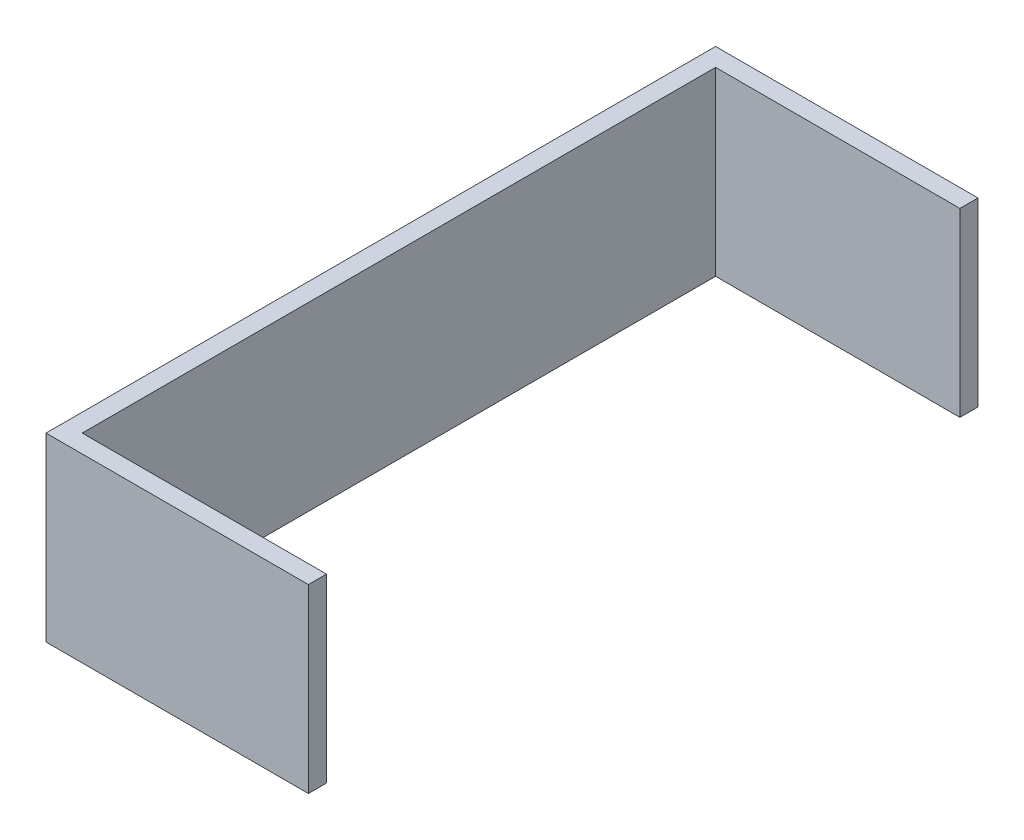
ISO-10303-21;
HEADER;
FILE_DESCRIPTION(('STEP AP214'),'2;1');
FILE_NAME('part.step','',(''),(''),'','','');
FILE_SCHEMA(('AUTOMOTIVE_DESIGN { 1 0 10303 214 1 1 1 1 }'));
ENDSEC;
DATA;
#1=APPLICATION_CONTEXT('core data for automotive mechanical design processes');
#2=APPLICATION_PROTOCOL_DEFINITION('international standard','automotive_design',2000,#1);
#3=PRODUCT_CONTEXT('',#1,'mechanical');
#4=PRODUCT('Part','Part','',(#3));
#5=PRODUCT_RELATED_PRODUCT_CATEGORY('part','',(#4));
#6=PRODUCT_DEFINITION_FORMATION('','',#4);
#7=PRODUCT_DEFINITION_CONTEXT('part definition',#1,'design');
#8=PRODUCT_DEFINITION('design','',#6,#7);
#9=PRODUCT_DEFINITION_SHAPE('','',#8);
#10=(LENGTH_UNIT() NAMED_UNIT(*) SI_UNIT(.MILLI.,.METRE.));
#11=(NAMED_UNIT(*) PLANE_ANGLE_UNIT() SI_UNIT($,.RADIAN.));
#12=(NAMED_UNIT(*) SI_UNIT($,.STERADIAN.) SOLID_ANGLE_UNIT());
#13=UNCERTAINTY_MEASURE_WITH_UNIT(LENGTH_MEASURE(1.E-05),#10,'distance_accuracy_value','');
#14=(GEOMETRIC_REPRESENTATION_CONTEXT(3) GLOBAL_UNCERTAINTY_ASSIGNED_CONTEXT((#13)) GLOBAL_UNIT_ASSIGNED_CONTEXT((#10,
#11,#12)) REPRESENTATION_CONTEXT('',''));
#15=CARTESIAN_POINT('',(0.,0.,0.));
#16=DIRECTION('',(0.,0.,1.));
#17=DIRECTION('',(1.,0.,0.));
#18=AXIS2_PLACEMENT_3D('',#15,#16,#17);
#19=CARTESIAN_POINT('',(-125.,200.,350.));
#20=DIRECTION('',(0.,0.,1.));
#21=DIRECTION('',(1.,0.,0.));
#22=AXIS2_PLACEMENT_3D('',#19,#20,#21);
#23=PLANE('',#22);
#24=DIRECTION('',(-1.,0.,0.));
#25=VECTOR('',#24,1.);
#26=CARTESIAN_POINT('',(-125.,0.,350.));
#27=LINE('',#26,#25);
#28=CARTESIAN_POINT('',(145.,0.,350.));
#29=VERTEX_POINT('',#28);
#30=CARTESIAN_POINT('',(-125.,0.,350.));
#31=VERTEX_POINT('',#30);
#32=EDGE_CURVE('E83',#29,#31,#27,.T.);
#33=ORIENTED_EDGE('',*,*,#32,.T.);
#34=DIRECTION('',(0.,-1.,0.));
#35=VECTOR('',#34,1.);
#36=CARTESIAN_POINT('',(-125.,200.,350.));
#37=LINE('',#36,#35);
#38=CARTESIAN_POINT('',(-125.,200.,350.));
#39=VERTEX_POINT('',#38);
#40=EDGE_CURVE('E11',#39,#31,#37,.T.);
#41=ORIENTED_EDGE('',*,*,#40,.F.);
#42=DIRECTION('',(-1.,0.,0.));
#43=VECTOR('',#42,1.);
#44=CARTESIAN_POINT('',(125.,200.,350.));
#45=LINE('',#44,#43);
#46=CARTESIAN_POINT('',(145.,200.,350.));
#47=VERTEX_POINT('',#46);
#48=EDGE_CURVE('E89',#47,#39,#45,.T.);
#49=ORIENTED_EDGE('',*,*,#48,.F.);
#50=DIRECTION('',(0.,-1.,0.));
#51=VECTOR('',#50,1.);
#52=CARTESIAN_POINT('',(145.,200.,350.));
#53=LINE('',#52,#51);
#54=EDGE_CURVE('E123',#47,#29,#53,.T.);
#55=ORIENTED_EDGE('',*,*,#54,.T.);
#56=EDGE_LOOP('',(#33,#41,#49,#55));
#57=FACE_BOUND('',#56,.T.);
#58=ADVANCED_FACE('F31',(#57),#23,.F.);
#59=CARTESIAN_POINT('',(-125.,200.,-350.));
#60=DIRECTION('',(-1.,0.,0.));
#61=DIRECTION('',(0.,0.,1.));
#62=AXIS2_PLACEMENT_3D('',#59,#60,#61);
#63=PLANE('',#62);
#64=DIRECTION('',(0.,0.,-1.));
#65=VECTOR('',#64,1.);
#66=CARTESIAN_POINT('',(-125.,0.,-350.));
#67=LINE('',#66,#65);
#68=CARTESIAN_POINT('',(-125.,0.,-350.));
#69=VERTEX_POINT('',#68);
#70=EDGE_CURVE('E128',#31,#69,#67,.T.);
#71=ORIENTED_EDGE('',*,*,#70,.T.);
#72=DIRECTION('',(0.,-1.,0.));
#73=VECTOR('',#72,1.);
#74=CARTESIAN_POINT('',(-125.,200.,-350.));
#75=LINE('',#74,#73);
#76=CARTESIAN_POINT('',(-125.,200.,-350.));
#77=VERTEX_POINT('',#76);
#78=EDGE_CURVE('E39',#77,#69,#75,.T.);
#79=ORIENTED_EDGE('',*,*,#78,.F.);
#80=DIRECTION('',(0.,0.,-1.));
#81=VECTOR('',#80,1.);
#82=CARTESIAN_POINT('',(-125.,200.,-350.));
#83=LINE('',#82,#81);
#84=EDGE_CURVE('E160',#39,#77,#83,.T.);
#85=ORIENTED_EDGE('',*,*,#84,.F.);
#86=ORIENTED_EDGE('',*,*,#40,.T.);
#87=EDGE_LOOP('',(#71,#79,#85,#86));
#88=FACE_BOUND('',#87,.T.);
#89=ADVANCED_FACE('F159',(#88),#63,.F.);
#90=CARTESIAN_POINT('',(125.,200.,-350.));
#91=DIRECTION('',(0.,0.,-1.));
#92=DIRECTION('',(-1.,0.,0.));
#93=AXIS2_PLACEMENT_3D('',#90,#91,#92);
#94=PLANE('',#93);
#95=DIRECTION('',(1.,0.,0.));
#96=VECTOR('',#95,1.);
#97=CARTESIAN_POINT('',(125.,0.,-350.));
#98=LINE('',#97,#96);
#99=CARTESIAN_POINT('',(145.,0.,-350.));
#100=VERTEX_POINT('',#99);
#101=EDGE_CURVE('E131',#69,#100,#98,.T.);
#102=ORIENTED_EDGE('',*,*,#101,.T.);
#103=DIRECTION('',(0.,-1.,0.));
#104=VECTOR('',#103,1.);
#105=CARTESIAN_POINT('',(145.,200.,-350.));
#106=LINE('',#105,#104);
#107=CARTESIAN_POINT('',(145.,200.,-350.));
#108=VERTEX_POINT('',#107);
#109=EDGE_CURVE('E148',#108,#100,#106,.T.);
#110=ORIENTED_EDGE('',*,*,#109,.F.);
#111=DIRECTION('',(1.,0.,0.));
#112=VECTOR('',#111,1.);
#113=CARTESIAN_POINT('',(-125.,200.,-350.));
#114=LINE('',#113,#112);
#115=EDGE_CURVE('E156',#77,#108,#114,.T.);
#116=ORIENTED_EDGE('',*,*,#115,.F.);
#117=ORIENTED_EDGE('',*,*,#78,.T.);
#118=EDGE_LOOP('',(#102,#110,#116,#117));
#119=FACE_BOUND('',#118,.T.);
#120=ADVANCED_FACE('F154',(#119),#94,.F.);
#121=CARTESIAN_POINT('',(145.,200.,-370.));
#122=DIRECTION('',(-1.,0.,0.));
#123=DIRECTION('',(0.,0.,1.));
#124=AXIS2_PLACEMENT_3D('',#121,#122,#123);
#125=PLANE('',#124);
#126=DIRECTION('',(0.,0.,-1.));
#127=VECTOR('',#126,1.);
#128=CARTESIAN_POINT('',(145.,0.,-370.));
#129=LINE('',#128,#127);
#130=CARTESIAN_POINT('',(145.,0.,-370.));
#131=VERTEX_POINT('',#130);
#132=EDGE_CURVE('E133',#100,#131,#129,.T.);
#133=ORIENTED_EDGE('',*,*,#132,.T.);
#134=DIRECTION('',(0.,-1.,0.));
#135=VECTOR('',#134,1.);
#136=CARTESIAN_POINT('',(145.,200.,-370.));
#137=LINE('',#136,#135);
#138=CARTESIAN_POINT('',(145.,200.,-370.));
#139=VERTEX_POINT('',#138);
#140=EDGE_CURVE('E145',#139,#131,#137,.T.);
#141=ORIENTED_EDGE('',*,*,#140,.F.);
#142=DIRECTION('',(0.,0.,-1.));
#143=VECTOR('',#142,1.);
#144=CARTESIAN_POINT('',(145.,200.,-370.));
#145=LINE('',#144,#143);
#146=EDGE_CURVE('E170',#108,#139,#145,.T.);
#147=ORIENTED_EDGE('',*,*,#146,.F.);
#148=ORIENTED_EDGE('',*,*,#109,.T.);
#149=EDGE_LOOP('',(#133,#141,#147,#148));
#150=FACE_BOUND('',#149,.T.);
#151=ADVANCED_FACE('F166',(#150),#125,.F.);
#152=CARTESIAN_POINT('',(-145.,200.,-370.));
#153=DIRECTION('',(0.,0.,1.));
#154=DIRECTION('',(1.,0.,0.));
#155=AXIS2_PLACEMENT_3D('',#152,#153,#154);
#156=PLANE('',#155);
#157=DIRECTION('',(-1.,0.,0.));
#158=VECTOR('',#157,1.);
#159=CARTESIAN_POINT('',(-145.,0.,-370.));
#160=LINE('',#159,#158);
#161=CARTESIAN_POINT('',(-145.,0.,-370.));
#162=VERTEX_POINT('',#161);
#163=EDGE_CURVE('E135',#131,#162,#160,.T.);
#164=ORIENTED_EDGE('',*,*,#163,.T.);
#165=DIRECTION('',(0.,-1.,0.));
#166=VECTOR('',#165,1.);
#167=CARTESIAN_POINT('',(-145.,200.,-370.));
#168=LINE('',#167,#166);
#169=CARTESIAN_POINT('',(-145.,200.,-370.));
#170=VERTEX_POINT('',#169);
#171=EDGE_CURVE('E118',#170,#162,#168,.T.);
#172=ORIENTED_EDGE('',*,*,#171,.F.);
#173=DIRECTION('',(-1.,0.,0.));
#174=VECTOR('',#173,1.);
#175=CARTESIAN_POINT('',(-145.,200.,-370.));
#176=LINE('',#175,#174);
#177=EDGE_CURVE('E109',#139,#170,#176,.T.);
#178=ORIENTED_EDGE('',*,*,#177,.F.);
#179=ORIENTED_EDGE('',*,*,#140,.T.);
#180=EDGE_LOOP('',(#164,#172,#178,#179));
#181=FACE_BOUND('',#180,.T.);
#182=ADVANCED_FACE('F169',(#181),#156,.F.);
#183=CARTESIAN_POINT('',(-145.,200.,-370.));
#184=DIRECTION('',(1.,0.,0.));
#185=DIRECTION('',(0.,0.,-1.));
#186=AXIS2_PLACEMENT_3D('',#183,#184,#185);
#187=PLANE('',#186);
#188=DIRECTION('',(0.,0.,1.));
#189=VECTOR('',#188,1.);
#190=CARTESIAN_POINT('',(-145.,0.,-370.));
#191=LINE('',#190,#189);
#192=CARTESIAN_POINT('',(-145.,0.,370.));
#193=VERTEX_POINT('',#192);
#194=EDGE_CURVE('E117',#162,#193,#191,.T.);
#195=ORIENTED_EDGE('',*,*,#194,.T.);
#196=DIRECTION('',(0.,-1.,0.));
#197=VECTOR('',#196,1.);
#198=CARTESIAN_POINT('',(-145.,200.,370.));
#199=LINE('',#198,#197);
#200=CARTESIAN_POINT('',(-145.,200.,370.));
#201=VERTEX_POINT('',#200);
#202=EDGE_CURVE('E114',#201,#193,#199,.T.);
#203=ORIENTED_EDGE('',*,*,#202,.F.);
#204=DIRECTION('',(0.,0.,1.));
#205=VECTOR('',#204,1.);
#206=CARTESIAN_POINT('',(-145.,200.,-370.));
#207=LINE('',#206,#205);
#208=EDGE_CURVE('E103',#170,#201,#207,.T.);
#209=ORIENTED_EDGE('',*,*,#208,.F.);
#210=ORIENTED_EDGE('',*,*,#171,.T.);
#211=EDGE_LOOP('',(#195,#203,#209,#210));
#212=FACE_BOUND('',#211,.T.);
#213=ADVANCED_FACE('F115',(#212),#187,.F.);
#214=CARTESIAN_POINT('',(-145.,200.,370.));
#215=DIRECTION('',(0.,0.,-1.));
#216=DIRECTION('',(-1.,0.,0.));
#217=AXIS2_PLACEMENT_3D('',#214,#215,#216);
#218=PLANE('',#217);
#219=DIRECTION('',(1.,0.,0.));
#220=VECTOR('',#219,1.);
#221=CARTESIAN_POINT('',(-145.,0.,370.));
#222=LINE('',#221,#220);
#223=CARTESIAN_POINT('',(145.,0.,370.));
#224=VERTEX_POINT('',#223);
#225=EDGE_CURVE('E76',#193,#224,#222,.T.);
#226=ORIENTED_EDGE('',*,*,#225,.T.);
#227=DIRECTION('',(0.,-1.,0.));
#228=VECTOR('',#227,1.);
#229=CARTESIAN_POINT('',(145.,200.,370.));
#230=LINE('',#229,#228);
#231=CARTESIAN_POINT('',(145.,200.,370.));
#232=VERTEX_POINT('',#231);
#233=EDGE_CURVE('E119',#232,#224,#230,.T.);
#234=ORIENTED_EDGE('',*,*,#233,.F.);
#235=DIRECTION('',(1.,0.,0.));
#236=VECTOR('',#235,1.);
#237=CARTESIAN_POINT('',(-145.,200.,370.));
#238=LINE('',#237,#236);
#239=EDGE_CURVE('E107',#201,#232,#238,.T.);
#240=ORIENTED_EDGE('',*,*,#239,.F.);
#241=ORIENTED_EDGE('',*,*,#202,.T.);
#242=EDGE_LOOP('',(#226,#234,#240,#241));
#243=FACE_BOUND('',#242,.T.);
#244=ADVANCED_FACE('F121',(#243),#218,.F.);
#245=CARTESIAN_POINT('',(145.,200.,350.));
#246=DIRECTION('',(-1.,0.,0.));
#247=DIRECTION('',(0.,0.,1.));
#248=AXIS2_PLACEMENT_3D('',#245,#246,#247);
#249=PLANE('',#248);
#250=DIRECTION('',(0.,0.,-1.));
#251=VECTOR('',#250,1.);
#252=CARTESIAN_POINT('',(145.,0.,350.));
#253=LINE('',#252,#251);
#254=EDGE_CURVE('E139',#224,#29,#253,.T.);
#255=ORIENTED_EDGE('',*,*,#254,.T.);
#256=ORIENTED_EDGE('',*,*,#54,.F.);
#257=DIRECTION('',(0.,0.,-1.));
#258=VECTOR('',#257,1.);
#259=CARTESIAN_POINT('',(145.,200.,350.));
#260=LINE('',#259,#258);
#261=EDGE_CURVE('E47',#232,#47,#260,.T.);
#262=ORIENTED_EDGE('',*,*,#261,.F.);
#263=ORIENTED_EDGE('',*,*,#233,.T.);
#264=EDGE_LOOP('',(#255,#256,#262,#263));
#265=FACE_BOUND('',#264,.T.);
#266=ADVANCED_FACE('F176',(#265),#249,.F.);
#267=CARTESIAN_POINT('',(145.,200.,350.));
#268=DIRECTION('',(0.,-1.,0.));
#269=DIRECTION('',(0.,0.,-1.));
#270=AXIS2_PLACEMENT_3D('',#267,#268,#269);
#271=PLANE('',#270);
#272=ORIENTED_EDGE('',*,*,#48,.T.);
#273=ORIENTED_EDGE('',*,*,#84,.T.);
#274=ORIENTED_EDGE('',*,*,#115,.T.);
#275=ORIENTED_EDGE('',*,*,#146,.T.);
#276=ORIENTED_EDGE('',*,*,#177,.T.);
#277=ORIENTED_EDGE('',*,*,#208,.T.);
#278=ORIENTED_EDGE('',*,*,#239,.T.);
#279=ORIENTED_EDGE('',*,*,#261,.T.);
#280=EDGE_LOOP('',(#272,#273,#274,#275,#276,#277,#278,#279));
#281=FACE_BOUND('',#280,.T.);
#282=ADVANCED_FACE('F105',(#281),#271,.F.);
#283=CARTESIAN_POINT('',(145.,0.,350.));
#284=DIRECTION('',(0.,-1.,0.));
#285=DIRECTION('',(0.,0.,-1.));
#286=AXIS2_PLACEMENT_3D('',#283,#284,#285);
#287=PLANE('',#286);
#288=ORIENTED_EDGE('',*,*,#32,.F.);
#289=ORIENTED_EDGE('',*,*,#254,.F.);
#290=ORIENTED_EDGE('',*,*,#225,.F.);
#291=ORIENTED_EDGE('',*,*,#194,.F.);
#292=ORIENTED_EDGE('',*,*,#163,.F.);
#293=ORIENTED_EDGE('',*,*,#132,.F.);
#294=ORIENTED_EDGE('',*,*,#101,.F.);
#295=ORIENTED_EDGE('',*,*,#70,.F.);
#296=EDGE_LOOP('',(#288,#289,#290,#291,#292,#293,#294,#295));
#297=FACE_BOUND('',#296,.T.);
#298=ADVANCED_FACE('F161',(#297),#287,.T.);
#299=CLOSED_SHELL('',(#58,#89,#120,#151,#182,#213,#244,#266,#282,#298));
#300=MANIFOLD_SOLID_BREP('B2',#299);
#301=ADVANCED_BREP_SHAPE_REPRESENTATION('',(#18,#300),#14);
#302=SHAPE_DEFINITION_REPRESENTATION(#9,#301);
ENDSEC;
END-ISO-10303-21;
